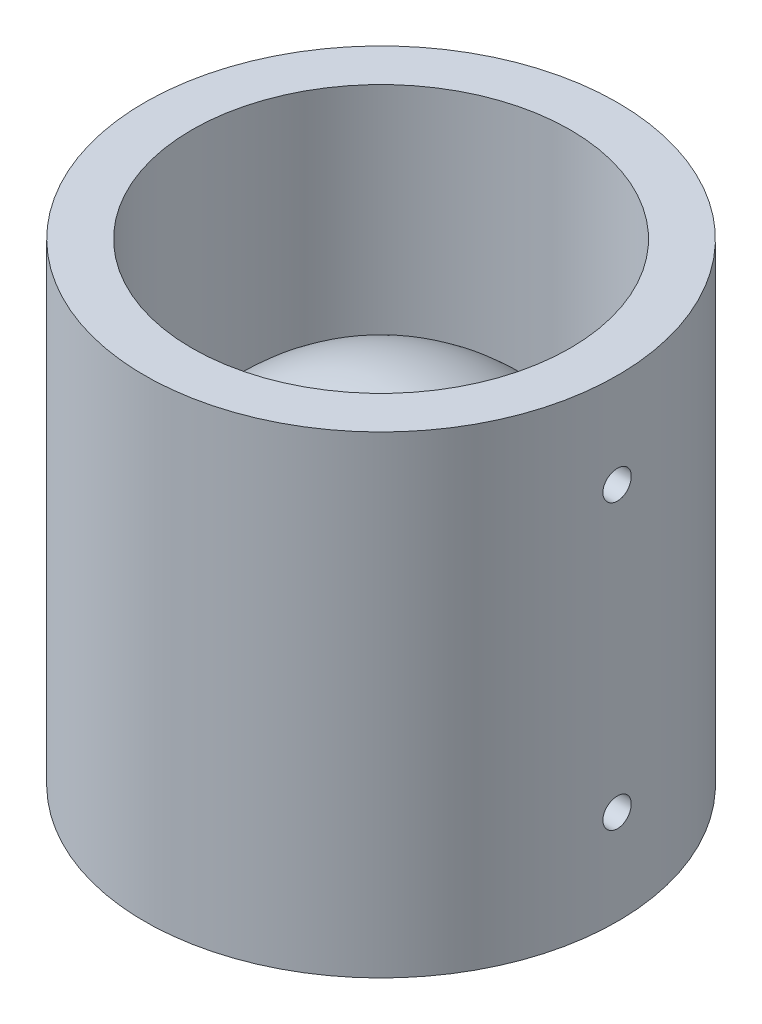
ISO-10303-21;
HEADER;
FILE_DESCRIPTION(('STEP AP214'),'2;1');
FILE_NAME('part.step','',(''),(''),'','','');
FILE_SCHEMA(('AUTOMOTIVE_DESIGN { 1 0 10303 214 1 1 1 1 }'));
ENDSEC;
DATA;
#1=APPLICATION_CONTEXT('core data for automotive mechanical design processes');
#2=APPLICATION_PROTOCOL_DEFINITION('international standard','automotive_design',2000,#1);
#3=PRODUCT_CONTEXT('',#1,'mechanical');
#4=PRODUCT('Part','Part','',(#3));
#5=PRODUCT_RELATED_PRODUCT_CATEGORY('part','',(#4));
#6=PRODUCT_DEFINITION_FORMATION('','',#4);
#7=PRODUCT_DEFINITION_CONTEXT('part definition',#1,'design');
#8=PRODUCT_DEFINITION('design','',#6,#7);
#9=PRODUCT_DEFINITION_SHAPE('','',#8);
#10=(LENGTH_UNIT() NAMED_UNIT(*) SI_UNIT(.MILLI.,.METRE.));
#11=(NAMED_UNIT(*) PLANE_ANGLE_UNIT() SI_UNIT($,.RADIAN.));
#12=(NAMED_UNIT(*) SI_UNIT($,.STERADIAN.) SOLID_ANGLE_UNIT());
#13=UNCERTAINTY_MEASURE_WITH_UNIT(LENGTH_MEASURE(1.E-05),#10,'distance_accuracy_value','');
#14=(GEOMETRIC_REPRESENTATION_CONTEXT(3) GLOBAL_UNCERTAINTY_ASSIGNED_CONTEXT((#13)) GLOBAL_UNIT_ASSIGNED_CONTEXT((#10,
#11,#12)) REPRESENTATION_CONTEXT('',''));
#15=CARTESIAN_POINT('',(0.,0.,0.));
#16=DIRECTION('',(0.,0.,1.));
#17=DIRECTION('',(1.,0.,0.));
#18=AXIS2_PLACEMENT_3D('',#15,#16,#17);
#19=CARTESIAN_POINT('',(0.,5.73796823456933,0.));
#20=DIRECTION('',(0.,-1.,0.));
#21=DIRECTION('',(1.,0.,0.));
#22=AXIS2_PLACEMENT_3D('',#19,#20,#21);
#23=SPHERICAL_SURFACE('',#22,7.49297439938258);
#24=CARTESIAN_POINT('',(0.,5.67051649999356,0.));
#25=DIRECTION('',(0.,1.,0.));
#26=DIRECTION('',(0.,0.,1.));
#27=AXIS2_PLACEMENT_3D('',#24,#25,#26);
#28=CIRCLE('',#27,7.49267079306875);
#29=CARTESIAN_POINT('',(7.48604805906733,5.67051649999356,0.314960427100931));
#30=VERTEX_POINT('',#29);
#31=EDGE_CURVE('E64',#30,#30,#28,.F.);
#32=ORIENTED_EDGE('',*,*,#31,.T.);
#33=EDGE_LOOP('',(#32));
#34=FACE_BOUND('',#33,.T.);
#35=ADVANCED_FACE('F43',(#34),#23,.F.);
#36=CARTESIAN_POINT('',(0.,4.5,0.));
#37=DIRECTION('',(0.,1.,0.));
#38=DIRECTION('',(0.,0.,1.));
#39=AXIS2_PLACEMENT_3D('',#36,#37,#38);
#40=PLANE('',#39);
#41=DIRECTION('',(1.,0.,0.));
#42=VECTOR('',#41,1.);
#43=CARTESIAN_POINT('',(-10.001,4.5,-0.331662479035538));
#44=LINE('',#43,#42);
#45=CARTESIAN_POINT('',(7.88302606871245,4.5,-0.331662479035538));
#46=VERTEX_POINT('',#45);
#47=CARTESIAN_POINT('',(7.99312204335702,4.5,-0.331662479035539));
#48=VERTEX_POINT('',#47);
#49=EDGE_CURVE('E83',#46,#48,#44,.T.);
#50=ORIENTED_EDGE('',*,*,#49,.F.);
#51=CARTESIAN_POINT('',(0.,4.5,0.));
#52=DIRECTION('',(0.,1.,0.));
#53=DIRECTION('',(0.,0.,1.));
#54=AXIS2_PLACEMENT_3D('',#51,#52,#53);
#55=CIRCLE('',#54,7.89);
#56=CARTESIAN_POINT('',(7.88302606871245,4.5,0.331662479035538));
#57=VERTEX_POINT('',#56);
#58=EDGE_CURVE('E59',#46,#57,#55,.T.);
#59=ORIENTED_EDGE('',*,*,#58,.T.);
#60=DIRECTION('',(1.,0.,0.));
#61=VECTOR('',#60,1.);
#62=CARTESIAN_POINT('',(-10.001,4.5,0.331662479035538));
#63=LINE('',#62,#61);
#64=CARTESIAN_POINT('',(7.99312204335702,4.5,0.331662479035539));
#65=VERTEX_POINT('',#64);
#66=EDGE_CURVE('E82',#65,#57,#63,.F.);
#67=ORIENTED_EDGE('',*,*,#66,.F.);
#68=CARTESIAN_POINT('',(0.,4.5,0.));
#69=DIRECTION('',(0.,-1.,0.));
#70=DIRECTION('',(0.,0.,-1.));
#71=AXIS2_PLACEMENT_3D('',#68,#69,#70);
#72=CIRCLE('',#71,8.);
#73=EDGE_CURVE('E93',#65,#48,#72,.T.);
#74=ORIENTED_EDGE('',*,*,#73,.T.);
#75=EDGE_LOOP('',(#50,#59,#67,#74));
#76=FACE_BOUND('',#75,.T.);
#77=ADVANCED_FACE('F92',(#76),#40,.F.);
#78=CARTESIAN_POINT('',(0.,0.,0.));
#79=DIRECTION('',(0.,-1.,0.));
#80=DIRECTION('',(0.,0.,-1.));
#81=AXIS2_PLACEMENT_3D('',#78,#79,#80);
#82=CYLINDRICAL_SURFACE('',#81,7.99999999999999);
#83=ORIENTED_EDGE('',*,*,#73,.F.);
#84=CARTESIAN_POINT('',(7.99312204335702,4.5,-0.331662479035539));
#85=CARTESIAN_POINT('',(7.9919551924553,4.48135658193221,-0.359819241128137));
#86=CARTESIAN_POINT('',(7.99070319760227,4.46029845782268,-0.386360285625036));
#87=CARTESIAN_POINT('',(7.98817330993855,4.41405527399395,-0.435531169568229));
#88=CARTESIAN_POINT('',(7.98689543462235,4.38887292557565,-0.458163558649343));
#89=CARTESIAN_POINT('',(7.98445569622418,4.33504484881155,-0.498885582432973));
#90=CARTESIAN_POINT('',(7.9832938882031,4.30639749081988,-0.51697306719573));
#91=CARTESIAN_POINT('',(7.98121876120062,4.24647149396577,-0.548078990688851));
#92=CARTESIAN_POINT('',(7.98030538731149,4.21519343853157,-0.561098549782692));
#93=CARTESIAN_POINT('',(7.97883111983276,4.15091864318889,-0.58168837019853));
#94=CARTESIAN_POINT('',(7.97826987358664,4.11792365877822,-0.589264084650678));
#95=CARTESIAN_POINT('',(7.97756216562363,4.05112090071889,-0.598769558352571));
#96=CARTESIAN_POINT('',(7.97741576114544,4.01731301555741,-0.600698538482945));
#97=CARTESIAN_POINT('',(7.97755438953877,3.94993770292873,-0.598854499648005));
#98=CARTESIAN_POINT('',(7.97783836078027,3.91636988832456,-0.595095511523841));
#99=CARTESIAN_POINT('',(7.97880356626453,3.85034576674942,-0.582010437155324));
#100=CARTESIAN_POINT('',(7.97948477618935,3.81788939186768,-0.572684691692962));
#101=CARTESIAN_POINT('',(7.9811676228716,3.75499820602654,-0.548731821478617));
#102=CARTESIAN_POINT('',(7.98216931811207,3.72456376526027,-0.53410372907513));
#103=CARTESIAN_POINT('',(7.98438033507722,3.66657842975022,-0.499962116655877));
#104=CARTESIAN_POINT('',(7.98558966457143,3.63902764297282,-0.480448413811553));
#105=CARTESIAN_POINT('',(7.98808334110147,3.58751951243529,-0.437032214907594));
#106=CARTESIAN_POINT('',(7.98936786672236,3.56357124874956,-0.413118955938128));
#107=CARTESIAN_POINT('',(7.99186469999935,3.52002580985975,-0.361610447796169));
#108=CARTESIAN_POINT('',(7.99307700762991,3.50042863619394,-0.334015197321956));
#109=CARTESIAN_POINT('',(7.99529414039448,3.46612471812611,-0.275893018294868));
#110=CARTESIAN_POINT('',(7.99629876976835,3.45142257994864,-0.245363363079088));
#111=CARTESIAN_POINT('',(7.99798578590602,3.42735556527207,-0.182259779847393));
#112=CARTESIAN_POINT('',(7.99866817679519,3.41799062044455,-0.149685878008493));
#113=CARTESIAN_POINT('',(7.999632637723,3.40488196506987,-0.0834901390255113));
#114=CARTESIAN_POINT('',(7.99991553139156,3.40112668833238,-0.0498706044050713));
#115=CARTESIAN_POINT('',(8.00005176879048,3.39930938803074,0.0175226043188359));
#116=CARTESIAN_POINT('',(7.99990511806224,3.40124729102097,0.0512962764282192));
#117=CARTESIAN_POINT('',(7.99919946978805,3.41075118770066,0.117973889781537));
#118=CARTESIAN_POINT('',(7.99864123135556,3.41830682052328,0.150879316803435));
#119=CARTESIAN_POINT('',(7.99717591104252,3.43881696008018,0.21495390631662));
#120=CARTESIAN_POINT('',(7.99626882596202,3.45177151633887,0.246123052878004));
#121=CARTESIAN_POINT('',(7.99420609023786,3.48272951920141,0.305884155875008));
#122=CARTESIAN_POINT('',(7.99305013176037,3.50073922702582,0.334472857813332));
#123=CARTESIAN_POINT('',(7.99061985989358,3.54129083529099,0.38822597191894));
#124=CARTESIAN_POINT('',(7.98934554471989,3.56383280406785,0.41339033244541));
#125=CARTESIAN_POINT('',(7.98681833559768,3.61287361061519,0.459643274451581));
#126=CARTESIAN_POINT('',(7.98556550035582,3.63938180883411,0.480721935870157));
#127=CARTESIAN_POINT('',(7.98322572259561,3.69556697434132,0.518130845574739));
#128=CARTESIAN_POINT('',(7.98213878000269,3.72524394020551,0.534461095994761));
#129=CARTESIAN_POINT('',(7.98025397194873,3.7869216944846,0.561904551072871));
#130=CARTESIAN_POINT('',(7.97945605317835,3.81892205305015,0.573018717929556));
#131=CARTESIAN_POINT('',(7.97823964995522,3.88434211771936,0.589714203962418));
#132=CARTESIAN_POINT('',(7.97782116302626,3.91776181455877,0.595295559246338));
#133=CARTESIAN_POINT('',(7.97741178451996,3.9849837863222,0.600756943186514));
#134=CARTESIAN_POINT('',(7.97741984758719,4.0187849229959,0.600650910041579));
#135=CARTESIAN_POINT('',(7.97786002656844,4.08588531797406,0.594775432596148));
#136=CARTESIAN_POINT('',(7.97829210233139,4.11918462349531,0.589006524530803));
#137=CARTESIAN_POINT('',(7.97953057049228,4.18430253748667,0.571982512545777));
#138=CARTESIAN_POINT('',(7.98033654909529,4.2161227401458,0.560733472750566));
#139=CARTESIAN_POINT('',(7.98223230549586,4.27744026367909,0.533065211311137));
#140=CARTESIAN_POINT('',(7.98332222204755,4.30693643964896,0.516643461055923));
#141=CARTESIAN_POINT('',(7.98566642923929,4.36283856686695,0.479047984795482));
#142=CARTESIAN_POINT('',(7.98692118914142,4.38923527241985,0.45786056479873));
#143=CARTESIAN_POINT('',(7.98944911726882,4.43805437339399,0.411387303384261));
#144=CARTESIAN_POINT('',(7.99072224134365,4.46048499184256,0.386110154919075));
#145=CARTESIAN_POINT('',(7.99233744923157,4.48734254103545,0.350177863901338));
#146=CARTESIAN_POINT('',(7.99273453002105,4.4938048846829,0.341005609986196));
#147=CARTESIAN_POINT('',(7.99312204335702,4.5,0.331662479035539));
#148=B_SPLINE_CURVE_WITH_KNOTS('',3,(#84,#85,#86,#87,#88,#89,#90,#91,#92,#93,#94,#95,#96,#97,
#98,#99,#100,#101,#102,#103,#104,#105,#106,#107,#108,#109,#110,#111,#112,#113,#114,#115,#116,
#117,#118,#119,#120,#121,#122,#123,#124,#125,#126,#127,#128,#129,#130,#131,#132,#133,#134,#135,
#136,#137,#138,#139,#140,#141,#142,#143,#144,#145,#146,#147),.UNSPECIFIED.,.F.,.F.,(4,2,2,2,2,2,
2,2,2,2,2,2,2,2,2,2,2,2,2,2,2,2,2,2,2,2,2,2,2,2,2,4),(0.,0.101234289351687,0.20240229159875,
0.303618061048203,0.404811442059326,0.505903315244276,0.607009136123678,0.707865959665612,
0.808716609655761,0.909585673653368,1.01045851292181,1.11158148674226,1.21270449631354,
1.31392239537782,1.4151389985896,1.51614662077722,1.617152939908,1.71797343216468,
1.81879484926976,1.91974169723371,2.02069006735893,2.12188055107217,2.22307098930866,
2.32424275384036,2.42541385810953,2.52633703164554,2.62725064937577,2.72805285236079,
2.8289044078396,2.93004954537441,3.03098245128557,3.06464471950169),.UNSPECIFIED.);
#149=EDGE_CURVE('E78',#48,#65,#148,.T.);
#150=ORIENTED_EDGE('',*,*,#149,.F.);
#151=EDGE_LOOP('',(#83,#150));
#152=FACE_BOUND('',#151,.T.);
#153=CARTESIAN_POINT('',(0.,0.,0.));
#154=DIRECTION('',(0.,-1.,0.));
#155=DIRECTION('',(0.,0.,-1.));
#156=AXIS2_PLACEMENT_3D('',#153,#154,#155);
#157=CIRCLE('',#156,8.);
#158=CARTESIAN_POINT('',(0.,0.,-8.));
#159=VERTEX_POINT('',#158);
#160=EDGE_CURVE('E101',#159,#159,#157,.T.);
#161=ORIENTED_EDGE('',*,*,#160,.T.);
#162=EDGE_LOOP('',(#161));
#163=FACE_BOUND('',#162,.T.);
#164=ADVANCED_FACE('F98',(#152,#163),#82,.F.);
#165=CARTESIAN_POINT('',(0.,0.,0.));
#166=DIRECTION('',(0.,1.,0.));
#167=DIRECTION('',(0.,0.,1.));
#168=AXIS2_PLACEMENT_3D('',#165,#166,#167);
#169=PLANE('',#168);
#170=ORIENTED_EDGE('',*,*,#160,.F.);
#171=EDGE_LOOP('',(#170));
#172=FACE_BOUND('',#171,.T.);
#173=CARTESIAN_POINT('',(0.,0.,0.));
#174=DIRECTION('',(0.,-1.,0.));
#175=DIRECTION('',(0.,0.,-1.));
#176=AXIS2_PLACEMENT_3D('',#173,#174,#175);
#177=CIRCLE('',#176,10.);
#178=CARTESIAN_POINT('',(0.,0.,-10.));
#179=VERTEX_POINT('',#178);
#180=EDGE_CURVE('E107',#179,#179,#177,.T.);
#181=ORIENTED_EDGE('',*,*,#180,.T.);
#182=EDGE_LOOP('',(#181));
#183=FACE_BOUND('',#182,.T.);
#184=ADVANCED_FACE('F195',(#172,#183),#169,.F.);
#185=CARTESIAN_POINT('',(0.,0.,0.));
#186=DIRECTION('',(0.,-1.,0.));
#187=DIRECTION('',(0.,0.,-1.));
#188=AXIS2_PLACEMENT_3D('',#185,#186,#187);
#189=CYLINDRICAL_SURFACE('',#188,9.99999999999999);
#190=CARTESIAN_POINT('',(9.98198377077422,16.,-0.6));
#191=CARTESIAN_POINT('',(9.98198401201266,15.9663302969984,-0.599998517471414));
#192=CARTESIAN_POINT('',(9.98215595678526,15.9326369525919,-0.597156354895668));
#193=CARTESIAN_POINT('',(9.98282524653582,15.8661804305153,-0.585859096831607));
#194=CARTESIAN_POINT('',(9.9833229712693,15.8334183850051,-0.577397450649356));
#195=CARTESIAN_POINT('',(9.98458724111525,15.7697967237153,-0.555104977990247));
#196=CARTESIAN_POINT('',(9.98535364536831,15.7389361210232,-0.54127696450929));
#197=CARTESIAN_POINT('',(9.98706873955508,15.6799821970989,-0.508648784748042));
#198=CARTESIAN_POINT('',(9.98801738745489,15.6518882400046,-0.489849764638792));
#199=CARTESIAN_POINT('',(9.98999157888623,15.5992177332203,-0.447784352817084));
#200=CARTESIAN_POINT('',(9.99101721555019,15.574645551772,-0.424512495508009));
#201=CARTESIAN_POINT('',(9.99302894926315,15.5297534676358,-0.374173227142782));
#202=CARTESIAN_POINT('',(9.99401504466929,15.5094337414807,-0.347105658592688));
#203=CARTESIAN_POINT('',(9.99583736833412,15.4736102635826,-0.289919070083359));
#204=CARTESIAN_POINT('',(9.99667348547989,15.4581100762602,-0.259797813414392));
#205=CARTESIAN_POINT('',(9.99810066684227,15.4323885032237,-0.197374580626784));
#206=CARTESIAN_POINT('',(9.99869173351435,15.422167064615,-0.165072626363024));
#207=CARTESIAN_POINT('',(9.99956157430731,15.407305121757,-0.0992465731113265));
#208=CARTESIAN_POINT('',(9.99984072723838,15.4026578473415,-0.0657240077489322));
#209=CARTESIAN_POINT('',(10.0000565601673,15.3990552476271,0.00162647869638917));
#210=CARTESIAN_POINT('',(9.99999324377189,15.4000998623848,0.0354543965597843));
#211=CARTESIAN_POINT('',(9.99953158937065,15.407845796417,0.102409483640514));
#212=CARTESIAN_POINT('',(9.99913368274436,15.4145398320632,0.135537498876274));
#213=CARTESIAN_POINT('',(9.99804814710845,15.4333832885348,0.200198802329732));
#214=CARTESIAN_POINT('',(9.9973605164938,15.4455327395823,0.231732081711797));
#215=CARTESIAN_POINT('',(9.99577222039046,15.4749504085879,0.292332195931483));
#216=CARTESIAN_POINT('',(9.99487141744278,15.4922219312158,0.321397422804532));
#217=CARTESIAN_POINT('',(9.99295816926915,15.5313910620792,0.376218813487534));
#218=CARTESIAN_POINT('',(9.99194572288876,15.5532887181529,0.401974943074146));
#219=CARTESIAN_POINT('',(9.98992126372086,15.6011296668371,0.44948952190777));
#220=CARTESIAN_POINT('',(9.9889092541312,15.6270792807659,0.471241607059718));
#221=CARTESIAN_POINT('',(9.98700135868553,15.6822653709414,0.510081576134667));
#222=CARTESIAN_POINT('',(9.986105472872,15.7115018483899,0.527169458352121));
#223=CARTESIAN_POINT('',(9.98453098174427,15.7724357500159,0.556195483697501));
#224=CARTESIAN_POINT('',(9.9838523874765,15.804133299205,0.568133365025969));
#225=CARTESIAN_POINT('',(9.98278940556902,15.8690877386378,0.586516153179477));
#226=CARTESIAN_POINT('',(9.98240501474084,15.9023446119782,0.592961119534703));
#227=CARTESIAN_POINT('',(9.98197438414036,15.9694181623076,0.600167212491188));
#228=CARTESIAN_POINT('',(9.98192761823907,16.0032338859576,0.600937182614));
#229=CARTESIAN_POINT('',(9.98217613712487,16.0705140162166,0.596794526461525));
#230=CARTESIAN_POINT('',(9.98247142027366,16.1039784245075,0.591881927404157));
#231=CARTESIAN_POINT('',(9.98337027924553,16.1695810203571,0.57652092722602));
#232=CARTESIAN_POINT('',(9.98397362853823,16.2017201636821,0.566076593547019));
#233=CARTESIAN_POINT('',(9.98542043237127,16.2637894049039,0.539952719606717));
#234=CARTESIAN_POINT('',(9.98626388891815,16.2937194843372,0.524273135594714));
#235=CARTESIAN_POINT('',(9.98809713085294,16.350561628579,0.488101226622521));
#236=CARTESIAN_POINT('',(9.98908709594341,16.3774699146393,0.467602972809797));
#237=CARTESIAN_POINT('',(9.99110116089289,16.4274665907769,0.422384230608713));
#238=CARTESIAN_POINT('',(9.99212526106074,16.4505549462798,0.397663704008521));
#239=CARTESIAN_POINT('',(9.99409372687307,16.492286205633,0.344664096943036));
#240=CARTESIAN_POINT('',(9.99503798891735,16.5109233890188,0.316380507882733));
#241=CARTESIAN_POINT('',(9.99673888695872,16.5431841265669,0.257080341335412));
#242=CARTESIAN_POINT('',(9.99749552403932,16.5568077096827,0.226063779632466));
#243=CARTESIAN_POINT('',(9.99873541734025,16.5786445614047,0.162199199042471));
#244=CARTESIAN_POINT('',(9.9992188568999,16.5868614589778,0.129352424688534));
#245=CARTESIAN_POINT('',(9.99985861043105,16.597663569989,0.0627424887048634));
#246=CARTESIAN_POINT('',(10.0000149273218,16.6002488336846,0.0289793352557671));
#247=CARTESIAN_POINT('',(9.99998283121433,16.5997138080637,-0.0384482932984691));
#248=CARTESIAN_POINT('',(9.99979495938778,16.5966024755739,-0.0721128400987218));
#249=CARTESIAN_POINT('',(9.99909669083327,16.5847811358038,-0.138440627620139));
#250=CARTESIAN_POINT('',(9.99858629352841,16.5760711185094,-0.171103866550194));
#251=CARTESIAN_POINT('',(9.99730035413457,16.5533016393493,-0.234503300307762));
#252=CARTESIAN_POINT('',(9.99652481296467,16.5392421960267,-0.265239501814638));
#253=CARTESIAN_POINT('',(9.99479569274723,16.5061742576283,-0.323916197833749));
#254=CARTESIAN_POINT('',(9.99384211850181,16.487165896035,-0.351856767721765));
#255=CARTESIAN_POINT('',(9.99186243901885,16.4447067657487,-0.40419438450406));
#256=CARTESIAN_POINT('',(9.99083623006023,16.4212495605617,-0.428586205652784));
#257=CARTESIAN_POINT('',(9.98882774883929,16.3705665221783,-0.473094054248563));
#258=CARTESIAN_POINT('',(9.98784548740359,16.3433397670296,-0.493209032609014));
#259=CARTESIAN_POINT('',(9.98603481255707,16.2858615020096,-0.528605904532303));
#260=CARTESIAN_POINT('',(9.98520658194916,16.2556064628376,-0.543882070342837));
#261=CARTESIAN_POINT('',(9.98380010736925,16.1929781520582,-0.569119208964381));
#262=CARTESIAN_POINT('',(9.98322157021377,16.1606074163762,-0.579086418650935));
#263=CARTESIAN_POINT('',(9.98253189126873,16.1066982986928,-0.590826934595602));
#264=CARTESIAN_POINT('',(9.98232726196914,16.0855085460526,-0.594262398212309));
#265=CARTESIAN_POINT('',(9.98205312497914,16.0428823925691,-0.598849401611936));
#266=CARTESIAN_POINT('',(9.98198361711686,16.0214459920396,-0.600000944299872));
#267=CARTESIAN_POINT('',(9.98198377077422,16.,-0.6));
#268=B_SPLINE_CURVE_WITH_KNOTS('',3,(#190,#191,#192,#193,#194,#195,#196,#197,#198,#199,#200,
#201,#202,#203,#204,#205,#206,#207,#208,#209,#210,#211,#212,#213,#214,#215,#216,#217,#218,#219,
#220,#221,#222,#223,#224,#225,#226,#227,#228,#229,#230,#231,#232,#233,#234,#235,#236,#237,#238,
#239,#240,#241,#242,#243,#244,#245,#246,#247,#248,#249,#250,#251,#252,#253,#254,#255,#256,#257,
#258,#259,#260,#261,#262,#263,#264,#265,#266,#267),.UNSPECIFIED.,.T.,.F.,(4,2,2,2,2,2,2,2,2,2,2,
2,2,2,2,2,2,2,2,2,2,2,2,2,2,2,2,2,2,2,2,2,2,2,2,2,2,2,4),(0.,0.100930818882166,
0.201979500938155,0.302975285679753,0.403947803974872,0.505044499524724,0.606145391081561,
0.707320877665382,0.80849535042221,0.909546815704641,1.01059721677675,1.11151753528352,
1.21243841287812,1.31342454501592,1.41441172148833,1.51555804826418,1.61670441202589,
1.71785591694087,1.81900632559922,1.91999907506485,2.02099134080544,2.12190945059531,
2.22282840377345,2.323872182797,2.4249168763215,2.5260907378854,2.62726401516577,
2.72836931549229,2.8294737135352,2.93041928041172,3.03136502784613,3.13231042537013,
3.23325310047191,3.33434294704152,3.43545756187376,3.53669142366835,3.63780609378393,
3.70209428460642,3.76638239365798),.UNSPECIFIED.);
#269=CARTESIAN_POINT('',(9.98198377077422,16.,-0.6));
#270=VERTEX_POINT('',#269);
#271=EDGE_CURVE('E129',#270,#270,#268,.T.);
#272=ORIENTED_EDGE('',*,*,#271,.T.);
#273=EDGE_LOOP('',(#272));
#274=FACE_BOUND('',#273,.T.);
#275=CARTESIAN_POINT('',(9.98198377077422,4.,-0.6));
#276=CARTESIAN_POINT('',(9.98198401201266,3.96633029699841,-0.599998517471414));
#277=CARTESIAN_POINT('',(9.98215595678526,3.93263695259193,-0.597156354895668));
#278=CARTESIAN_POINT('',(9.98282524653582,3.86618043051532,-0.585859096831607));
#279=CARTESIAN_POINT('',(9.9833229712693,3.83341838500508,-0.577397450649356));
#280=CARTESIAN_POINT('',(9.98458724111525,3.76979672371531,-0.555104977990247));
#281=CARTESIAN_POINT('',(9.98535364536831,3.7389361210232,-0.541276964509292));
#282=CARTESIAN_POINT('',(9.98706873955508,3.67998219709892,-0.508648784748044));
#283=CARTESIAN_POINT('',(9.98801738745489,3.6518882400046,-0.489849764638794));
#284=CARTESIAN_POINT('',(9.98999157888623,3.59921773322034,-0.447784352817085));
#285=CARTESIAN_POINT('',(9.99101721555019,3.57464555177201,-0.42451249550801));
#286=CARTESIAN_POINT('',(9.99302894926315,3.52975346763584,-0.374173227142782));
#287=CARTESIAN_POINT('',(9.99401504466929,3.50943374148068,-0.347105658592687));
#288=CARTESIAN_POINT('',(9.99583736833412,3.47361026358255,-0.289919070083357));
#289=CARTESIAN_POINT('',(9.99667348547989,3.45811007626022,-0.25979781341439));
#290=CARTESIAN_POINT('',(9.99810066684227,3.43238850322372,-0.197374580626783));
#291=CARTESIAN_POINT('',(9.99869173351435,3.42216706461498,-0.165072626363023));
#292=CARTESIAN_POINT('',(9.99956157430731,3.40730512175699,-0.0992465731113251));
#293=CARTESIAN_POINT('',(9.99984072723838,3.40265784734145,-0.0657240077489307));
#294=CARTESIAN_POINT('',(10.0000565601673,3.39905524762713,0.00162647869639071));
#295=CARTESIAN_POINT('',(9.99999324377189,3.40009986238483,0.0354543965597858));
#296=CARTESIAN_POINT('',(9.99953158937065,3.40784579641701,0.102409483640516));
#297=CARTESIAN_POINT('',(9.99913368274436,3.41453983206318,0.135537498876275));
#298=CARTESIAN_POINT('',(9.99804814710845,3.43338328853479,0.200198802329734));
#299=CARTESIAN_POINT('',(9.9973605164938,3.44553273958228,0.231732081711798));
#300=CARTESIAN_POINT('',(9.99577222039046,3.47495040858791,0.292332195931485));
#301=CARTESIAN_POINT('',(9.99487141744278,3.49222193121584,0.321397422804533));
#302=CARTESIAN_POINT('',(9.99295816926915,3.53139106207923,0.376218813487536));
#303=CARTESIAN_POINT('',(9.99194572288876,3.55328871815288,0.401974943074147));
#304=CARTESIAN_POINT('',(9.98992126372086,3.60112966683711,0.449489521907771));
#305=CARTESIAN_POINT('',(9.9889092541312,3.62707928076594,0.471241607059718));
#306=CARTESIAN_POINT('',(9.98700135868553,3.68226537094141,0.510081576134667));
#307=CARTESIAN_POINT('',(9.986105472872,3.71150184838995,0.527169458352121));
#308=CARTESIAN_POINT('',(9.98453098174427,3.77243575001595,0.556195483697502));
#309=CARTESIAN_POINT('',(9.9838523874765,3.80413329920497,0.56813336502597));
#310=CARTESIAN_POINT('',(9.98278940556902,3.86908773863783,0.586516153179477));
#311=CARTESIAN_POINT('',(9.98240501474084,3.90234461197816,0.592961119534703));
#312=CARTESIAN_POINT('',(9.98197438414036,3.96941816230764,0.600167212491188));
#313=CARTESIAN_POINT('',(9.98192761823906,4.00323388595765,0.600937182614));
#314=CARTESIAN_POINT('',(9.98217613712487,4.07051401621661,0.596794526461525));
#315=CARTESIAN_POINT('',(9.98247142027366,4.1039784245075,0.591881927404156));
#316=CARTESIAN_POINT('',(9.98337027924553,4.16958102035711,0.57652092722602));
#317=CARTESIAN_POINT('',(9.98397362853823,4.20172016368206,0.566076593547018));
#318=CARTESIAN_POINT('',(9.98542043237127,4.2637894049039,0.539952719606716));
#319=CARTESIAN_POINT('',(9.98626388891815,4.29371948433721,0.524273135594713));
#320=CARTESIAN_POINT('',(9.98809713085294,4.35056162857903,0.488101226622519));
#321=CARTESIAN_POINT('',(9.98908709594341,4.37746991463933,0.467602972809795));
#322=CARTESIAN_POINT('',(9.99110116089289,4.42746659077687,0.422384230608711));
#323=CARTESIAN_POINT('',(9.99212526106074,4.45055494627977,0.397663704008519));
#324=CARTESIAN_POINT('',(9.99409372687307,4.49228620563304,0.344664096943035));
#325=CARTESIAN_POINT('',(9.99503798891735,4.51092338901876,0.316380507882732));
#326=CARTESIAN_POINT('',(9.99673888695872,4.54318412656692,0.257080341335411));
#327=CARTESIAN_POINT('',(9.99749552403932,4.55680770968266,0.226063779632465));
#328=CARTESIAN_POINT('',(9.99873541734025,4.57864456140467,0.162199199042471));
#329=CARTESIAN_POINT('',(9.9992188568999,4.58686145897782,0.129352424688533));
#330=CARTESIAN_POINT('',(9.99985861043105,4.59766356998899,0.0627424887048629));
#331=CARTESIAN_POINT('',(10.0000149273218,4.60024883368462,0.0289793352557663));
#332=CARTESIAN_POINT('',(9.99998283121433,4.59971380806371,-0.0384482932984704));
#333=CARTESIAN_POINT('',(9.99979495938778,4.59660247557385,-0.0721128400987232));
#334=CARTESIAN_POINT('',(9.99909669083327,4.58478113580375,-0.138440627620141));
#335=CARTESIAN_POINT('',(9.99858629352841,4.57607111850935,-0.171103866550196));
#336=CARTESIAN_POINT('',(9.99730035413457,4.55330163934932,-0.234503300307764));
#337=CARTESIAN_POINT('',(9.99652481296467,4.53924219602669,-0.265239501814639));
#338=CARTESIAN_POINT('',(9.99479569274723,4.50617425762829,-0.32391619783375));
#339=CARTESIAN_POINT('',(9.99384211850181,4.48716589603499,-0.351856767721767));
#340=CARTESIAN_POINT('',(9.99186243901885,4.44470676574869,-0.404194384504062));
#341=CARTESIAN_POINT('',(9.99083623006023,4.42124956056175,-0.428586205652785));
#342=CARTESIAN_POINT('',(9.98882774883929,4.37056652217833,-0.473094054248563));
#343=CARTESIAN_POINT('',(9.98784548740359,4.34333976702956,-0.493209032609014));
#344=CARTESIAN_POINT('',(9.98603481255707,4.28586150200958,-0.528605904532304));
#345=CARTESIAN_POINT('',(9.98520658194916,4.25560646283758,-0.543882070342837));
#346=CARTESIAN_POINT('',(9.98380010736925,4.19297815205819,-0.569119208964382));
#347=CARTESIAN_POINT('',(9.98322157021377,4.1606074163762,-0.579086418650936));
#348=CARTESIAN_POINT('',(9.98253189126873,4.10669829869281,-0.590826934595602));
#349=CARTESIAN_POINT('',(9.98232726196914,4.08550854605257,-0.594262398212309));
#350=CARTESIAN_POINT('',(9.98205312497914,4.0428823925691,-0.598849401611936));
#351=CARTESIAN_POINT('',(9.98198361711686,4.02144599203962,-0.600000944299872));
#352=CARTESIAN_POINT('',(9.98198377077422,4.,-0.6));
#353=B_SPLINE_CURVE_WITH_KNOTS('',3,(#275,#276,#277,#278,#279,#280,#281,#282,#283,#284,#285,
#286,#287,#288,#289,#290,#291,#292,#293,#294,#295,#296,#297,#298,#299,#300,#301,#302,#303,#304,
#305,#306,#307,#308,#309,#310,#311,#312,#313,#314,#315,#316,#317,#318,#319,#320,#321,#322,#323,
#324,#325,#326,#327,#328,#329,#330,#331,#332,#333,#334,#335,#336,#337,#338,#339,#340,#341,#342,
#343,#344,#345,#346,#347,#348,#349,#350,#351,#352),.UNSPECIFIED.,.T.,.F.,(4,2,2,2,2,2,2,2,2,2,2,
2,2,2,2,2,2,2,2,2,2,2,2,2,2,2,2,2,2,2,2,2,2,2,2,2,2,2,4),(0.,0.100930818882166,
0.201979500938155,0.30297528567975,0.403947803974873,0.505044499524723,0.606145391081562,
0.707320877665384,0.808495350422212,0.909546815704643,1.01059721677675,1.11151753528352,
1.21243841287812,1.31342454501592,1.41441172148833,1.51555804826418,1.61670441202589,
1.71785591694087,1.81900632559922,1.91999907506485,2.02099134080545,2.12190945059531,
2.22282840377345,2.323872182797,2.42491687632151,2.5260907378854,2.62726401516577,
2.72836931549229,2.8294737135352,2.93041928041172,3.03136502784614,3.13231042537013,
3.23325310047191,3.33434294704152,3.43545756187376,3.53669142366835,3.63780609378394,
3.70209428460643,3.76638239365798),.UNSPECIFIED.);
#354=CARTESIAN_POINT('',(9.98198377077422,4.,-0.6));
#355=VERTEX_POINT('',#354);
#356=EDGE_CURVE('E88',#355,#355,#353,.T.);
#357=ORIENTED_EDGE('',*,*,#356,.T.);
#358=EDGE_LOOP('',(#357));
#359=FACE_BOUND('',#358,.T.);
#360=CARTESIAN_POINT('',(0.,20.,0.));
#361=DIRECTION('',(0.,-1.,0.));
#362=DIRECTION('',(0.,0.,-1.));
#363=AXIS2_PLACEMENT_3D('',#360,#361,#362);
#364=CIRCLE('',#363,9.99999999999999);
#365=CARTESIAN_POINT('',(0.,20.,-9.99999999999999));
#366=VERTEX_POINT('',#365);
#367=EDGE_CURVE('E114',#366,#366,#364,.T.);
#368=ORIENTED_EDGE('',*,*,#367,.T.);
#369=EDGE_LOOP('',(#368));
#370=FACE_BOUND('',#369,.T.);
#371=ORIENTED_EDGE('',*,*,#180,.F.);
#372=EDGE_LOOP('',(#371));
#373=FACE_BOUND('',#372,.T.);
#374=ADVANCED_FACE('F162',(#274,#359,#370,#373),#189,.T.);
#375=CARTESIAN_POINT('',(0.,20.,0.));
#376=DIRECTION('',(0.,1.,0.));
#377=DIRECTION('',(0.,0.,1.));
#378=AXIS2_PLACEMENT_3D('',#375,#376,#377);
#379=PLANE('',#378);
#380=CARTESIAN_POINT('',(0.,20.,0.));
#381=DIRECTION('',(0.,-1.,0.));
#382=DIRECTION('',(0.,0.,-1.));
#383=AXIS2_PLACEMENT_3D('',#380,#381,#382);
#384=CIRCLE('',#383,7.99999999999999);
#385=CARTESIAN_POINT('',(0.,20.,-7.99999999999999));
#386=VERTEX_POINT('',#385);
#387=EDGE_CURVE('E118',#386,#386,#384,.T.);
#388=ORIENTED_EDGE('',*,*,#387,.T.);
#389=EDGE_LOOP('',(#388));
#390=FACE_BOUND('',#389,.T.);
#391=ORIENTED_EDGE('',*,*,#367,.F.);
#392=EDGE_LOOP('',(#391));
#393=FACE_BOUND('',#392,.T.);
#394=ADVANCED_FACE('F175',(#390,#393),#379,.T.);
#395=CARTESIAN_POINT('',(7.97746827007165,16.,-0.6));
#396=CARTESIAN_POINT('',(7.97746856988437,15.9663486262888,-0.599998525137604));
#397=CARTESIAN_POINT('',(7.97768348879898,15.9326740592822,-0.597159442957756));
#398=CARTESIAN_POINT('',(7.97851998169433,15.8662558337408,-0.585875136551922));
#399=CARTESIAN_POINT('',(7.97914202189016,15.8335132874208,-0.577423484927314));
#400=CARTESIAN_POINT('',(7.98072190766465,15.7699307266278,-0.555159117299676));
#401=CARTESIAN_POINT('',(7.98167956853767,15.7390896766403,-0.54134934963812));
#402=CARTESIAN_POINT('',(7.98382255839157,15.680170997817,-0.508765803919407));
#403=CARTESIAN_POINT('',(7.98500783718459,15.6520927618639,-0.489993119800797));
#404=CARTESIAN_POINT('',(7.98747531926944,15.5994299904865,-0.447973731125693));
#405=CARTESIAN_POINT('',(7.98875769904765,15.5748520624417,-0.424718755202117));
#406=CARTESIAN_POINT('',(7.99127326484822,15.5299442701409,-0.374412269002708));
#407=CARTESIAN_POINT('',(7.99250644876222,15.5096145877925,-0.347360596237218));
#408=CARTESIAN_POINT('',(7.99478629582373,15.4737589791661,-0.290189948507521));
#409=CARTESIAN_POINT('',(7.99583273983272,15.4582386811622,-0.260067434184601));
#410=CARTESIAN_POINT('',(7.99761931282508,15.4324784151518,-0.19763491406266));
#411=CARTESIAN_POINT('',(7.99835944626414,15.4222383703365,-0.165324940091132));
#412=CARTESIAN_POINT('',(7.99944877598929,15.4073480642782,-0.099499700146816));
#413=CARTESIAN_POINT('',(7.99979871158728,15.4026872308088,-0.0659868381414821));
#414=CARTESIAN_POINT('',(8.00007071668974,15.3990549831103,0.00134723652170547));
#415=CARTESIAN_POINT('',(7.99999279279165,15.4000834811539,0.0351684444169564));
#416=CARTESIAN_POINT('',(7.99941847165682,15.4077920243416,0.102087499259964));
#417=CARTESIAN_POINT('',(7.99892291632422,15.4144606995368,0.135186664164389));
#418=CARTESIAN_POINT('',(7.99757006209774,15.4332426335594,0.199794516565008));
#419=CARTESIAN_POINT('',(7.99671276032145,15.4453559357698,0.231303191385847));
#420=CARTESIAN_POINT('',(7.9947314444418,15.4746960320733,0.291871969539568));
#421=CARTESIAN_POINT('',(7.99360716359765,15.4919279445564,0.320929584396592));
#422=CARTESIAN_POINT('',(7.99121831515041,15.5310123922369,0.375744237801219));
#423=CARTESIAN_POINT('',(7.9899537452515,15.5528650030572,0.40150122231925));
#424=CARTESIAN_POINT('',(7.9874228480337,15.600634671863,0.44904989689169));
#425=CARTESIAN_POINT('',(7.98615652405396,15.6265616047664,0.470831667534996));
#426=CARTESIAN_POINT('',(7.98376798822678,15.6817094549315,0.509735042662989));
#427=CARTESIAN_POINT('',(7.98264577646802,15.7109303742203,0.526856644279993));
#428=CARTESIAN_POINT('',(7.98067226731663,15.7718434017499,0.555953141961658));
#429=CARTESIAN_POINT('',(7.97982099480474,15.8035357366119,0.56792756538912));
#430=CARTESIAN_POINT('',(7.97848617999174,15.8684888322437,0.58638266871918));
#431=CARTESIAN_POINT('',(7.97800263144424,15.9017495663615,0.592863441940805));
#432=CARTESIAN_POINT('',(7.97745897806027,15.968808630763,0.600134808837854));
#433=CARTESIAN_POINT('',(7.97739784527452,16.0026054552366,0.600939216058462));
#434=CARTESIAN_POINT('',(7.97770322938823,16.0698535039402,0.596871160935834));
#435=CARTESIAN_POINT('',(7.9780697430667,16.1033047307712,0.591998741349749));
#436=CARTESIAN_POINT('',(7.97918818288931,16.1688726293425,0.576726840679878));
#437=CARTESIAN_POINT('',(7.97993966203596,16.2009908022863,0.56633376931154));
#438=CARTESIAN_POINT('',(7.98174298131735,16.2630273069495,0.540322091515218));
#439=CARTESIAN_POINT('',(7.98279482536722,16.2929456099883,0.524703416973444));
#440=CARTESIAN_POINT('',(7.98508284546534,16.3497964210229,0.488648785262478));
#441=CARTESIAN_POINT('',(7.98631937290007,16.3767230628408,0.468203600955791));
#442=CARTESIAN_POINT('',(7.98883622198468,16.4267669992974,0.423089684133942));
#443=CARTESIAN_POINT('',(7.9901165442464,16.4498842406907,0.39842089259367));
#444=CARTESIAN_POINT('',(7.99257975722925,16.4917001008431,0.345500428665762));
#445=CARTESIAN_POINT('',(7.99376244729282,16.5103897602776,0.317241666323336));
#446=CARTESIAN_POINT('',(7.99589425050314,16.5427585260376,0.257978888796078));
#447=CARTESIAN_POINT('',(7.99684336559983,16.5564376741926,0.226974896532085));
#448=CARTESIAN_POINT('',(7.99840014255108,16.578381643342,0.16313421359693));
#449=CARTESIAN_POINT('',(7.9990081572577,16.5866520608837,0.130299455577291));
#450=CARTESIAN_POINT('',(7.9998156491379,16.5975621038801,0.0637026371281334));
#451=CARTESIAN_POINT('',(8.00001513243004,16.6002018136657,0.0299405905942585));
#452=CARTESIAN_POINT('',(7.99998309898776,16.5997746051157,-0.0374639608918834));
#453=CARTESIAN_POINT('',(7.99975263866761,16.5967216741745,-0.071106555886509));
#454=CARTESIAN_POINT('',(7.99888871195944,16.5850249424674,-0.137399880597972));
#455=CARTESIAN_POINT('',(7.9982552449455,16.576381133018,-0.170050608774215));
#456=CARTESIAN_POINT('',(7.99665643220109,16.5537514077827,-0.233434756787568));
#457=CARTESIAN_POINT('',(7.99569109730758,16.5397656664327,-0.264168239192515));
#458=CARTESIAN_POINT('',(7.99353671396911,16.5068507868986,-0.322853054813226));
#459=CARTESIAN_POINT('',(7.99234767003987,16.4879217484953,-0.350804444169969));
#460=CARTESIAN_POINT('',(7.9898759771343,16.4456052756967,-0.403203050129561));
#461=CARTESIAN_POINT('',(7.98859311656889,16.4222075587553,-0.42764195255384));
#462=CARTESIAN_POINT('',(7.98608015379749,16.3716350541886,-0.472254655873226));
#463=CARTESIAN_POINT('',(7.98485006450075,16.3444593491858,-0.492427417848185));
#464=CARTESIAN_POINT('',(7.98257977007235,16.2870590766872,-0.527957059770478));
#465=CARTESIAN_POINT('',(7.981539870927,16.2568297155186,-0.543306207275481));
#466=CARTESIAN_POINT('',(7.97977149623148,16.1942363084257,-0.568691745251987));
#467=CARTESIAN_POINT('',(7.97904265991174,16.1618747859591,-0.578734293536323));
#468=CARTESIAN_POINT('',(7.97816793089981,16.1077660059381,-0.590640998132489));
#469=CARTESIAN_POINT('',(7.97790674950367,16.0863675479995,-0.594146013968125));
#470=CARTESIAN_POINT('',(7.9775568227698,16.0433159301374,-0.598825987169515));
#471=CARTESIAN_POINT('',(7.97746807706988,16.021662770749,-0.600000949429472));
#472=CARTESIAN_POINT('',(7.97746827007165,16.,-0.6));
#473=B_SPLINE_CURVE_WITH_KNOTS('',3,(#395,#396,#397,#398,#399,#400,#401,#402,#403,#404,#405,
#406,#407,#408,#409,#410,#411,#412,#413,#414,#415,#416,#417,#418,#419,#420,#421,#422,#423,#424,
#425,#426,#427,#428,#429,#430,#431,#432,#433,#434,#435,#436,#437,#438,#439,#440,#441,#442,#443,
#444,#445,#446,#447,#448,#449,#450,#451,#452,#453,#454,#455,#456,#457,#458,#459,#460,#461,#462,
#463,#464,#465,#466,#467,#468,#469,#470,#471,#472),.UNSPECIFIED.,.T.,.F.,(4,2,2,2,2,2,2,2,2,2,2,
2,2,2,2,2,2,2,2,2,2,2,2,2,2,2,2,2,2,2,2,2,2,2,2,2,2,2,4),(0.,0.100875031735621,
0.201865783144318,0.302801042304877,0.40371407158457,0.504815134436006,0.605920525494318,
0.7071437940841,0.808365590193872,0.909395272696641,1.01042339736511,1.11124834503832,
1.21207409610559,1.3130010099483,1.41392957570017,1.51510664562552,1.61628377781108,
1.71747019855528,1.81865490044095,1.91959328223792,2.02053090378452,2.12135158772383,
2.2221735858744,2.32318991530263,2.42420765655411,2.52542809633949,2.62664769108136,
2.7277623849978,2.82887556451186,2.92974062603568,3.03060584421789,3.1314677690177,
3.23232765807122,3.33342248713656,3.43454190723866,3.53582260847461,3.63698552337989,
3.70192305893406,3.76686045808886),.UNSPECIFIED.);
#474=CARTESIAN_POINT('',(7.97746827007165,16.,-0.6));
#475=VERTEX_POINT('',#474);
#476=EDGE_CURVE('E96',#475,#475,#473,.T.);
#477=ORIENTED_EDGE('',*,*,#476,.F.);
#478=EDGE_LOOP('',(#477));
#479=FACE_BOUND('',#478,.T.);
#480=ORIENTED_EDGE('',*,*,#387,.F.);
#481=EDGE_LOOP('',(#480));
#482=FACE_BOUND('',#481,.T.);
#483=CARTESIAN_POINT('',(0.,8.5,0.));
#484=DIRECTION('',(0.,-1.,0.));
#485=DIRECTION('',(0.,0.,-1.));
#486=AXIS2_PLACEMENT_3D('',#483,#484,#485);
#487=CIRCLE('',#486,7.99999999999999);
#488=CARTESIAN_POINT('',(0.,8.5,-7.99999999999999));
#489=VERTEX_POINT('',#488);
#490=EDGE_CURVE('E122',#489,#489,#487,.T.);
#491=ORIENTED_EDGE('',*,*,#490,.T.);
#492=EDGE_LOOP('',(#491));
#493=FACE_BOUND('',#492,.T.);
#494=ADVANCED_FACE('F171',(#479,#482,#493),#82,.F.);
#495=CARTESIAN_POINT('',(0.,8.5,0.));
#496=DIRECTION('',(0.,1.,0.));
#497=DIRECTION('',(0.,0.,1.));
#498=AXIS2_PLACEMENT_3D('',#495,#496,#497);
#499=PLANE('',#498);
#500=CARTESIAN_POINT('',(0.,8.5,0.));
#501=DIRECTION('',(0.,-1.,0.));
#502=DIRECTION('',(0.,0.,-1.));
#503=AXIS2_PLACEMENT_3D('',#500,#501,#502);
#504=CIRCLE('',#503,7.99);
#505=CARTESIAN_POINT('',(0.,8.5,-7.99));
#506=VERTEX_POINT('',#505);
#507=EDGE_CURVE('E126',#506,#506,#504,.T.);
#508=ORIENTED_EDGE('',*,*,#507,.T.);
#509=EDGE_LOOP('',(#508));
#510=FACE_BOUND('',#509,.T.);
#511=ORIENTED_EDGE('',*,*,#490,.F.);
#512=EDGE_LOOP('',(#511));
#513=FACE_BOUND('',#512,.T.);
#514=ADVANCED_FACE('F174',(#510,#513),#499,.T.);
#515=CARTESIAN_POINT('',(0.,6.35908595247535,0.));
#516=DIRECTION('',(0.,-1.,0.));
#517=DIRECTION('',(1.,0.,0.));
#518=AXIS2_PLACEMENT_3D('',#515,#516,#517);
#519=SPHERICAL_SURFACE('',#518,8.27185668147656);
#520=ORIENTED_EDGE('',*,*,#507,.F.);
#521=EDGE_LOOP('',(#520));
#522=FACE_BOUND('',#521,.T.);
#523=ADVANCED_FACE('F168',(#522),#519,.T.);
#524=CARTESIAN_POINT('',(-10.001,16.,0.));
#525=DIRECTION('',(1.,0.,0.));
#526=DIRECTION('',(0.,0.,-1.));
#527=AXIS2_PLACEMENT_3D('',#524,#525,#526);
#528=CYLINDRICAL_SURFACE('',#527,0.6);
#529=ORIENTED_EDGE('',*,*,#271,.F.);
#530=EDGE_LOOP('',(#529));
#531=FACE_BOUND('',#530,.T.);
#532=ORIENTED_EDGE('',*,*,#476,.T.);
#533=EDGE_LOOP('',(#532));
#534=FACE_BOUND('',#533,.T.);
#535=ADVANCED_FACE('F165',(#531,#534),#528,.F.);
#536=CARTESIAN_POINT('',(-10.001,4.,0.));
#537=DIRECTION('',(1.,0.,0.));
#538=DIRECTION('',(0.,0.,-1.));
#539=AXIS2_PLACEMENT_3D('',#536,#537,#538);
#540=CYLINDRICAL_SURFACE('',#539,0.6);
#541=ORIENTED_EDGE('',*,*,#66,.T.);
#542=CARTESIAN_POINT('',(7.88302606871245,4.5,0.331662479035538));
#543=CARTESIAN_POINT('',(7.87804790942324,4.51802757069317,0.304543623400813));
#544=CARTESIAN_POINT('',(7.87373711198082,4.53385036551162,0.27583763541266));
#545=CARTESIAN_POINT('',(7.86648863017587,4.56068222146564,0.216095708836679));
#546=CARTESIAN_POINT('',(7.86355100397421,4.57169107870495,0.185059671623895));
#547=CARTESIAN_POINT('',(7.8590857248529,4.58849664882041,0.121476528973379));
#548=CARTESIAN_POINT('',(7.85755931087415,4.59428878167994,0.0889281220606437));
#549=CARTESIAN_POINT('',(7.85593592316226,4.60045084363819,0.0233092563816246));
#550=CARTESIAN_POINT('',(7.85583797568112,4.60082446639162,-0.00976083137303404));
#551=CARTESIAN_POINT('',(7.85706485203699,4.59616466921672,-0.0751926482681888));
#552=CARTESIAN_POINT('',(7.85837698742551,4.59117946984536,-0.107558065125959));
#553=CARTESIAN_POINT('',(7.8623918401016,4.57604399578136,-0.170990642558248));
#554=CARTESIAN_POINT('',(7.86509549858642,4.56589022522586,-0.20205690901716));
#555=CARTESIAN_POINT('',(7.87187449022679,4.54071517215961,-0.262081528758392));
#556=CARTESIAN_POINT('',(7.87595343260292,4.52568108591733,-0.291034089176313));
#557=CARTESIAN_POINT('',(7.88542255934323,4.49127611061771,-0.345988716870023));
#558=CARTESIAN_POINT('',(7.89081239951744,4.47190636004069,-0.37199155600236));
#559=CARTESIAN_POINT('',(7.896829432222,4.45062616318962,-0.396151563229281));
#560=B_SPLINE_CURVE_WITH_KNOTS('',3,(#542,#543,#544,#545,#546,#547,#548,#549,#550,#551,#552,
#553,#554,#555,#556,#557,#558,#559),.UNSPECIFIED.,.F.,.F.,(4,2,2,2,2,2,2,2,4),(0.,
0.0987141694454761,0.197432519564655,0.29623745508943,0.394975034740624,0.492831519310728,
0.590754279122504,0.688936048670694,0.787092067342588),.UNSPECIFIED.);
#561=EDGE_CURVE('E11',#57,#46,#560,.T.);
#562=ORIENTED_EDGE('',*,*,#561,.T.);
#563=ORIENTED_EDGE('',*,*,#49,.T.);
#564=ORIENTED_EDGE('',*,*,#149,.T.);
#565=EDGE_LOOP('',(#541,#562,#563,#564));
#566=FACE_BOUND('',#565,.T.);
#567=ORIENTED_EDGE('',*,*,#356,.F.);
#568=EDGE_LOOP('',(#567));
#569=FACE_BOUND('',#568,.T.);
#570=ADVANCED_FACE('F80',(#566,#569),#540,.F.);
#571=CARTESIAN_POINT('',(0.,5.67051649999356,0.));
#572=DIRECTION('',(0.,-1.,0.));
#573=DIRECTION('',(0.,0.,-1.));
#574=AXIS2_PLACEMENT_3D('',#571,#572,#573);
#575=CONICAL_SURFACE('',#574,7.49267079306874,0.3272434096299);
#576=ORIENTED_EDGE('',*,*,#561,.F.);
#577=ORIENTED_EDGE('',*,*,#58,.F.);
#578=EDGE_LOOP('',(#576,#577));
#579=FACE_BOUND('',#578,.T.);
#580=ORIENTED_EDGE('',*,*,#31,.F.);
#581=EDGE_LOOP('',(#580));
#582=FACE_BOUND('',#581,.T.);
#583=ADVANCED_FACE('F46',(#579,#582),#575,.F.);
#584=CLOSED_SHELL('',(#35,#77,#164,#184,#374,#394,#494,#514,#523,#535,#570,#583));
#585=MANIFOLD_SOLID_BREP('B2',#584);
#586=ADVANCED_BREP_SHAPE_REPRESENTATION('',(#18,#585),#14);
#587=SHAPE_DEFINITION_REPRESENTATION(#9,#586);
ENDSEC;
END-ISO-10303-21;
